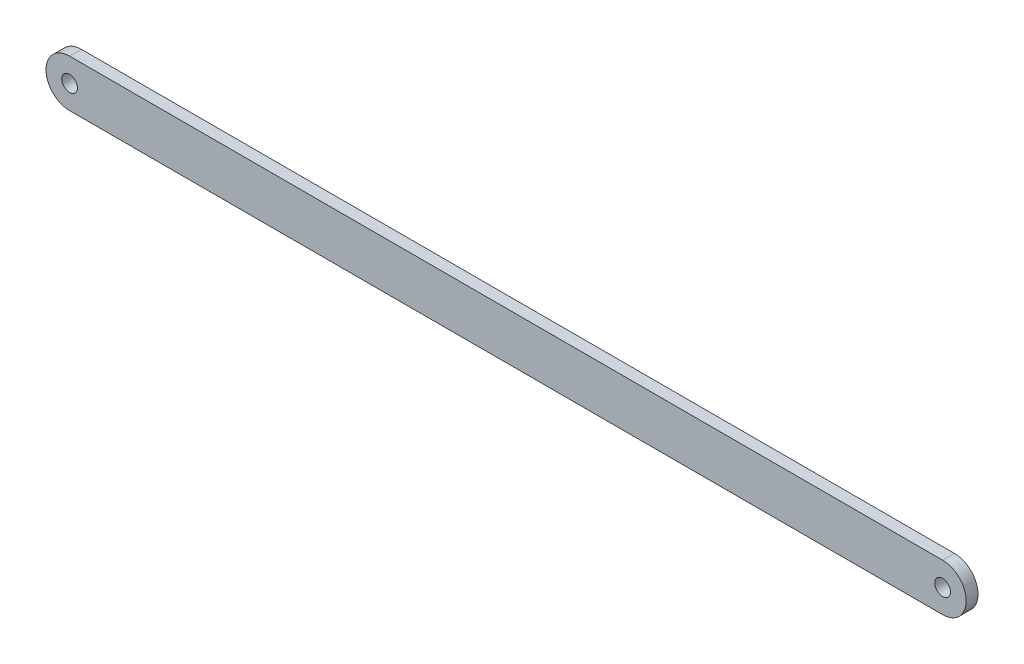
ISO-10303-21;
HEADER;
FILE_DESCRIPTION(('STEP AP214'),'2;1');
FILE_NAME('part.step','',(''),(''),'','','');
FILE_SCHEMA(('AUTOMOTIVE_DESIGN { 1 0 10303 214 1 1 1 1 }'));
ENDSEC;
DATA;
#1=APPLICATION_CONTEXT('core data for automotive mechanical design processes');
#2=APPLICATION_PROTOCOL_DEFINITION('international standard','automotive_design',2000,#1);
#3=PRODUCT_CONTEXT('',#1,'mechanical');
#4=PRODUCT('Part','Part','',(#3));
#5=PRODUCT_RELATED_PRODUCT_CATEGORY('part','',(#4));
#6=PRODUCT_DEFINITION_FORMATION('','',#4);
#7=PRODUCT_DEFINITION_CONTEXT('part definition',#1,'design');
#8=PRODUCT_DEFINITION('design','',#6,#7);
#9=PRODUCT_DEFINITION_SHAPE('','',#8);
#10=(LENGTH_UNIT() NAMED_UNIT(*) SI_UNIT(.MILLI.,.METRE.));
#11=(NAMED_UNIT(*) PLANE_ANGLE_UNIT() SI_UNIT($,.RADIAN.));
#12=(NAMED_UNIT(*) SI_UNIT($,.STERADIAN.) SOLID_ANGLE_UNIT());
#13=UNCERTAINTY_MEASURE_WITH_UNIT(LENGTH_MEASURE(1.E-05),#10,'distance_accuracy_value','');
#14=(GEOMETRIC_REPRESENTATION_CONTEXT(3) GLOBAL_UNCERTAINTY_ASSIGNED_CONTEXT((#13)) GLOBAL_UNIT_ASSIGNED_CONTEXT((#10,
#11,#12)) REPRESENTATION_CONTEXT('',''));
#15=CARTESIAN_POINT('',(0.,0.,0.));
#16=DIRECTION('',(0.,0.,1.));
#17=DIRECTION('',(1.,0.,0.));
#18=AXIS2_PLACEMENT_3D('',#15,#16,#17);
#19=CARTESIAN_POINT('',(-35.3127241673783,0.,3.));
#20=DIRECTION('',(0.,0.,1.));
#21=DIRECTION('',(1.,0.,0.));
#22=AXIS2_PLACEMENT_3D('',#19,#20,#21);
#23=PLANE('',#22);
#24=CARTESIAN_POINT('',(-35.3127241673783,0.,3.));
#25=DIRECTION('',(0.,0.,1.));
#26=DIRECTION('',(1.,0.,0.));
#27=AXIS2_PLACEMENT_3D('',#24,#25,#26);
#28=CIRCLE('',#27,2.);
#29=CARTESIAN_POINT('',(-33.3127241673783,0.,3.));
#30=VERTEX_POINT('',#29);
#31=EDGE_CURVE('E100',#30,#30,#28,.T.);
#32=ORIENTED_EDGE('',*,*,#31,.F.);
#33=EDGE_LOOP('',(#32));
#34=FACE_BOUND('',#33,.T.);
#35=CARTESIAN_POINT('',(-35.3127241673783,0.,3.));
#36=DIRECTION('',(0.,0.,1.));
#37=DIRECTION('',(1.,0.,0.));
#38=AXIS2_PLACEMENT_3D('',#35,#36,#37);
#39=CIRCLE('',#38,6.);
#40=CARTESIAN_POINT('',(-35.3127241673783,6.,3.));
#41=VERTEX_POINT('',#40);
#42=CARTESIAN_POINT('',(-35.3127241673783,-6.,3.));
#43=VERTEX_POINT('',#42);
#44=EDGE_CURVE('E85',#41,#43,#39,.T.);
#45=ORIENTED_EDGE('',*,*,#44,.T.);
#46=DIRECTION('',(1.,0.,0.));
#47=VECTOR('',#46,1.);
#48=CARTESIAN_POINT('',(-35.3127241673783,-6.,3.));
#49=LINE('',#48,#47);
#50=CARTESIAN_POINT('',(186.687275832622,-6.,3.));
#51=VERTEX_POINT('',#50);
#52=EDGE_CURVE('E80',#43,#51,#49,.T.);
#53=ORIENTED_EDGE('',*,*,#52,.T.);
#54=CARTESIAN_POINT('',(186.687275832622,0.,3.));
#55=DIRECTION('',(0.,0.,1.));
#56=DIRECTION('',(1.,0.,0.));
#57=AXIS2_PLACEMENT_3D('',#54,#55,#56);
#58=CIRCLE('',#57,6.);
#59=CARTESIAN_POINT('',(186.687275832622,6.,3.));
#60=VERTEX_POINT('',#59);
#61=EDGE_CURVE('E83',#51,#60,#58,.T.);
#62=ORIENTED_EDGE('',*,*,#61,.T.);
#63=DIRECTION('',(-1.,0.,0.));
#64=VECTOR('',#63,1.);
#65=CARTESIAN_POINT('',(-35.3127241673783,6.,3.));
#66=LINE('',#65,#64);
#67=EDGE_CURVE('E50',#60,#41,#66,.T.);
#68=ORIENTED_EDGE('',*,*,#67,.T.);
#69=EDGE_LOOP('',(#45,#53,#62,#68));
#70=FACE_BOUND('',#69,.T.);
#71=CARTESIAN_POINT('',(186.687275832622,0.,3.));
#72=DIRECTION('',(0.,0.,1.));
#73=DIRECTION('',(1.,0.,0.));
#74=AXIS2_PLACEMENT_3D('',#71,#72,#73);
#75=CIRCLE('',#74,2.);
#76=CARTESIAN_POINT('',(188.687275832622,0.,3.));
#77=VERTEX_POINT('',#76);
#78=EDGE_CURVE('E115',#77,#77,#75,.T.);
#79=ORIENTED_EDGE('',*,*,#78,.F.);
#80=EDGE_LOOP('',(#79));
#81=FACE_BOUND('',#80,.T.);
#82=ADVANCED_FACE('F33',(#34,#70,#81),#23,.T.);
#83=CARTESIAN_POINT('',(-35.3127241673783,0.,0.));
#84=DIRECTION('',(0.,0.,1.));
#85=DIRECTION('',(1.,0.,0.));
#86=AXIS2_PLACEMENT_3D('',#83,#84,#85);
#87=PLANE('',#86);
#88=CARTESIAN_POINT('',(-35.3127241673783,0.,0.));
#89=DIRECTION('',(0.,0.,1.));
#90=DIRECTION('',(1.,0.,0.));
#91=AXIS2_PLACEMENT_3D('',#88,#89,#90);
#92=CIRCLE('',#91,2.);
#93=CARTESIAN_POINT('',(-33.3127241673783,0.,0.));
#94=VERTEX_POINT('',#93);
#95=EDGE_CURVE('E112',#94,#94,#92,.T.);
#96=ORIENTED_EDGE('',*,*,#95,.T.);
#97=EDGE_LOOP('',(#96));
#98=FACE_BOUND('',#97,.T.);
#99=CARTESIAN_POINT('',(-35.3127241673783,0.,0.));
#100=DIRECTION('',(0.,0.,1.));
#101=DIRECTION('',(1.,0.,0.));
#102=AXIS2_PLACEMENT_3D('',#99,#100,#101);
#103=CIRCLE('',#102,6.);
#104=CARTESIAN_POINT('',(-35.3127241673783,6.,0.));
#105=VERTEX_POINT('',#104);
#106=CARTESIAN_POINT('',(-35.3127241673783,-6.,0.));
#107=VERTEX_POINT('',#106);
#108=EDGE_CURVE('E97',#105,#107,#103,.T.);
#109=ORIENTED_EDGE('',*,*,#108,.F.);
#110=DIRECTION('',(-1.,0.,0.));
#111=VECTOR('',#110,1.);
#112=CARTESIAN_POINT('',(-35.3127241673783,6.,0.));
#113=LINE('',#112,#111);
#114=CARTESIAN_POINT('',(186.687275832622,6.,0.));
#115=VERTEX_POINT('',#114);
#116=EDGE_CURVE('E73',#115,#105,#113,.T.);
#117=ORIENTED_EDGE('',*,*,#116,.F.);
#118=CARTESIAN_POINT('',(186.687275832622,0.,0.));
#119=DIRECTION('',(0.,0.,1.));
#120=DIRECTION('',(1.,0.,0.));
#121=AXIS2_PLACEMENT_3D('',#118,#119,#120);
#122=CIRCLE('',#121,6.);
#123=CARTESIAN_POINT('',(186.687275832622,-6.,0.));
#124=VERTEX_POINT('',#123);
#125=EDGE_CURVE('E67',#124,#115,#122,.T.);
#126=ORIENTED_EDGE('',*,*,#125,.F.);
#127=DIRECTION('',(1.,0.,0.));
#128=VECTOR('',#127,1.);
#129=CARTESIAN_POINT('',(-35.3127241673783,-6.,0.));
#130=LINE('',#129,#128);
#131=EDGE_CURVE('E89',#107,#124,#130,.T.);
#132=ORIENTED_EDGE('',*,*,#131,.F.);
#133=EDGE_LOOP('',(#109,#117,#126,#132));
#134=FACE_BOUND('',#133,.T.);
#135=CARTESIAN_POINT('',(186.687275832622,0.,0.));
#136=DIRECTION('',(0.,0.,1.));
#137=DIRECTION('',(1.,0.,0.));
#138=AXIS2_PLACEMENT_3D('',#135,#136,#137);
#139=CIRCLE('',#138,2.);
#140=CARTESIAN_POINT('',(188.687275832622,0.,0.));
#141=VERTEX_POINT('',#140);
#142=EDGE_CURVE('E118',#141,#141,#139,.T.);
#143=ORIENTED_EDGE('',*,*,#142,.T.);
#144=EDGE_LOOP('',(#143));
#145=FACE_BOUND('',#144,.T.);
#146=ADVANCED_FACE('F108',(#98,#134,#145),#87,.F.);
#147=CARTESIAN_POINT('',(-35.3127241673783,0.,3.));
#148=DIRECTION('',(0.,0.,-1.));
#149=DIRECTION('',(-1.,0.,0.));
#150=AXIS2_PLACEMENT_3D('',#147,#148,#149);
#151=CYLINDRICAL_SURFACE('',#150,6.);
#152=ORIENTED_EDGE('',*,*,#108,.T.);
#153=DIRECTION('',(0.,0.,-1.));
#154=VECTOR('',#153,1.);
#155=CARTESIAN_POINT('',(-35.3127241673783,-6.,3.));
#156=LINE('',#155,#154);
#157=EDGE_CURVE('E11',#43,#107,#156,.T.);
#158=ORIENTED_EDGE('',*,*,#157,.F.);
#159=ORIENTED_EDGE('',*,*,#44,.F.);
#160=DIRECTION('',(0.,0.,-1.));
#161=VECTOR('',#160,1.);
#162=CARTESIAN_POINT('',(-35.3127241673783,6.,3.));
#163=LINE('',#162,#161);
#164=EDGE_CURVE('E93',#41,#105,#163,.T.);
#165=ORIENTED_EDGE('',*,*,#164,.T.);
#166=EDGE_LOOP('',(#152,#158,#159,#165));
#167=FACE_BOUND('',#166,.T.);
#168=ADVANCED_FACE('F35',(#167),#151,.T.);
#169=CARTESIAN_POINT('',(-35.3127241673783,-6.,3.));
#170=DIRECTION('',(0.,1.,0.));
#171=DIRECTION('',(0.,0.,1.));
#172=AXIS2_PLACEMENT_3D('',#169,#170,#171);
#173=PLANE('',#172);
#174=ORIENTED_EDGE('',*,*,#131,.T.);
#175=DIRECTION('',(0.,0.,-1.));
#176=VECTOR('',#175,1.);
#177=CARTESIAN_POINT('',(186.687275832622,-6.,3.));
#178=LINE('',#177,#176);
#179=EDGE_CURVE('E42',#51,#124,#178,.T.);
#180=ORIENTED_EDGE('',*,*,#179,.F.);
#181=ORIENTED_EDGE('',*,*,#52,.F.);
#182=ORIENTED_EDGE('',*,*,#157,.T.);
#183=EDGE_LOOP('',(#174,#180,#181,#182));
#184=FACE_BOUND('',#183,.T.);
#185=ADVANCED_FACE('F88',(#184),#173,.F.);
#186=CARTESIAN_POINT('',(186.687275832622,0.,3.));
#187=DIRECTION('',(0.,0.,-1.));
#188=DIRECTION('',(-1.,0.,0.));
#189=AXIS2_PLACEMENT_3D('',#186,#187,#188);
#190=CYLINDRICAL_SURFACE('',#189,6.);
#191=ORIENTED_EDGE('',*,*,#125,.T.);
#192=DIRECTION('',(0.,0.,-1.));
#193=VECTOR('',#192,1.);
#194=CARTESIAN_POINT('',(186.687275832622,6.,3.));
#195=LINE('',#194,#193);
#196=EDGE_CURVE('E90',#60,#115,#195,.T.);
#197=ORIENTED_EDGE('',*,*,#196,.F.);
#198=ORIENTED_EDGE('',*,*,#61,.F.);
#199=ORIENTED_EDGE('',*,*,#179,.T.);
#200=EDGE_LOOP('',(#191,#197,#198,#199));
#201=FACE_BOUND('',#200,.T.);
#202=ADVANCED_FACE('F91',(#201),#190,.T.);
#203=CARTESIAN_POINT('',(-35.3127241673783,6.,3.));
#204=DIRECTION('',(0.,-1.,0.));
#205=DIRECTION('',(0.,0.,-1.));
#206=AXIS2_PLACEMENT_3D('',#203,#204,#205);
#207=PLANE('',#206);
#208=ORIENTED_EDGE('',*,*,#116,.T.);
#209=ORIENTED_EDGE('',*,*,#164,.F.);
#210=ORIENTED_EDGE('',*,*,#67,.F.);
#211=ORIENTED_EDGE('',*,*,#196,.T.);
#212=EDGE_LOOP('',(#208,#209,#210,#211));
#213=FACE_BOUND('',#212,.T.);
#214=ADVANCED_FACE('F105',(#213),#207,.F.);
#215=CARTESIAN_POINT('',(-35.3127241673783,0.,3.));
#216=DIRECTION('',(0.,0.,-1.));
#217=DIRECTION('',(-1.,0.,0.));
#218=AXIS2_PLACEMENT_3D('',#215,#216,#217);
#219=CYLINDRICAL_SURFACE('',#218,2.);
#220=ORIENTED_EDGE('',*,*,#31,.T.);
#221=EDGE_LOOP('',(#220));
#222=FACE_BOUND('',#221,.T.);
#223=ORIENTED_EDGE('',*,*,#95,.F.);
#224=EDGE_LOOP('',(#223));
#225=FACE_BOUND('',#224,.T.);
#226=ADVANCED_FACE('F136',(#222,#225),#219,.F.);
#227=CARTESIAN_POINT('',(186.687275832622,0.,3.));
#228=DIRECTION('',(0.,0.,-1.));
#229=DIRECTION('',(-1.,0.,0.));
#230=AXIS2_PLACEMENT_3D('',#227,#228,#229);
#231=CYLINDRICAL_SURFACE('',#230,2.);
#232=ORIENTED_EDGE('',*,*,#78,.T.);
#233=EDGE_LOOP('',(#232));
#234=FACE_BOUND('',#233,.T.);
#235=ORIENTED_EDGE('',*,*,#142,.F.);
#236=EDGE_LOOP('',(#235));
#237=FACE_BOUND('',#236,.T.);
#238=ADVANCED_FACE('F124',(#234,#237),#231,.F.);
#239=CLOSED_SHELL('',(#82,#146,#168,#185,#202,#214,#226,#238));
#240=MANIFOLD_SOLID_BREP('B2',#239);
#241=ADVANCED_BREP_SHAPE_REPRESENTATION('',(#18,#240),#14);
#242=SHAPE_DEFINITION_REPRESENTATION(#9,#241);
ENDSEC;
END-ISO-10303-21;
